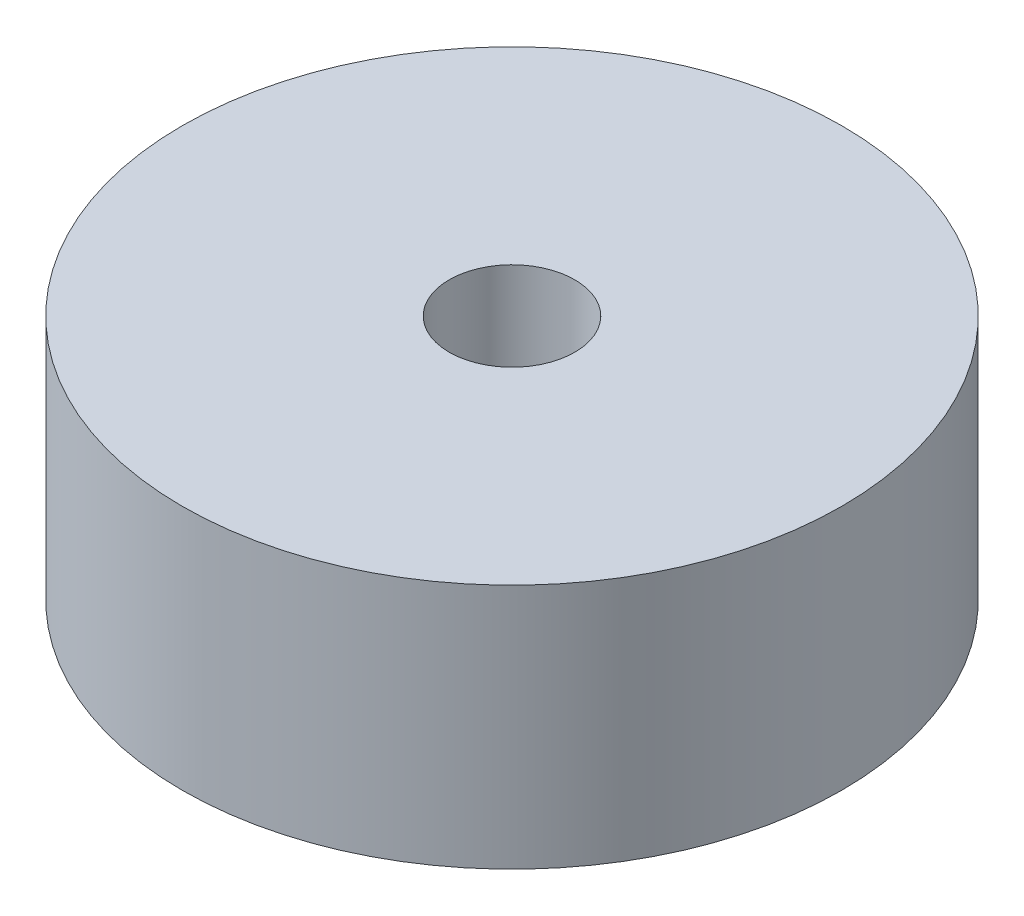
ISO-10303-21;
HEADER;
FILE_DESCRIPTION(('STEP AP214'),'2;1');
FILE_NAME('part.step','',(''),(''),'','','');
FILE_SCHEMA(('AUTOMOTIVE_DESIGN { 1 0 10303 214 1 1 1 1 }'));
ENDSEC;
DATA;
#1=APPLICATION_CONTEXT('core data for automotive mechanical design processes');
#2=APPLICATION_PROTOCOL_DEFINITION('international standard','automotive_design',2000,#1);
#3=PRODUCT_CONTEXT('',#1,'mechanical');
#4=PRODUCT('Part','Part','',(#3));
#5=PRODUCT_RELATED_PRODUCT_CATEGORY('part','',(#4));
#6=PRODUCT_DEFINITION_FORMATION('','',#4);
#7=PRODUCT_DEFINITION_CONTEXT('part definition',#1,'design');
#8=PRODUCT_DEFINITION('design','',#6,#7);
#9=PRODUCT_DEFINITION_SHAPE('','',#8);
#10=(LENGTH_UNIT() NAMED_UNIT(*) SI_UNIT(.MILLI.,.METRE.));
#11=(NAMED_UNIT(*) PLANE_ANGLE_UNIT() SI_UNIT($,.RADIAN.));
#12=(NAMED_UNIT(*) SI_UNIT($,.STERADIAN.) SOLID_ANGLE_UNIT());
#13=UNCERTAINTY_MEASURE_WITH_UNIT(LENGTH_MEASURE(1.E-05),#10,'distance_accuracy_value','');
#14=(GEOMETRIC_REPRESENTATION_CONTEXT(3) GLOBAL_UNCERTAINTY_ASSIGNED_CONTEXT((#13)) GLOBAL_UNIT_ASSIGNED_CONTEXT((#10,
#11,#12)) REPRESENTATION_CONTEXT('',''));
#15=CARTESIAN_POINT('',(0.,0.,0.));
#16=DIRECTION('',(0.,0.,1.));
#17=DIRECTION('',(1.,0.,0.));
#18=AXIS2_PLACEMENT_3D('',#15,#16,#17);
#19=CARTESIAN_POINT('',(0.,23.5,0.));
#20=DIRECTION('',(0.,-1.,0.));
#21=DIRECTION('',(0.,0.,-1.));
#22=AXIS2_PLACEMENT_3D('',#19,#20,#21);
#23=CYLINDRICAL_SURFACE('',#22,31.5);
#24=CARTESIAN_POINT('',(0.,23.5,0.));
#25=DIRECTION('',(0.,1.,0.));
#26=DIRECTION('',(0.,0.,1.));
#27=AXIS2_PLACEMENT_3D('',#24,#25,#26);
#28=CIRCLE('',#27,31.5);
#29=CARTESIAN_POINT('',(0.,23.5,31.5));
#30=VERTEX_POINT('',#29);
#31=EDGE_CURVE('E10',#30,#30,#28,.T.);
#32=ORIENTED_EDGE('',*,*,#31,.F.);
#33=EDGE_LOOP('',(#32));
#34=FACE_BOUND('',#33,.T.);
#35=CARTESIAN_POINT('',(0.,0.,0.));
#36=DIRECTION('',(0.,1.,0.));
#37=DIRECTION('',(0.,0.,1.));
#38=AXIS2_PLACEMENT_3D('',#35,#36,#37);
#39=CIRCLE('',#38,31.5);
#40=CARTESIAN_POINT('',(0.,0.,31.5));
#41=VERTEX_POINT('',#40);
#42=EDGE_CURVE('E33',#41,#41,#39,.T.);
#43=ORIENTED_EDGE('',*,*,#42,.T.);
#44=EDGE_LOOP('',(#43));
#45=FACE_BOUND('',#44,.T.);
#46=ADVANCED_FACE('F30',(#34,#45),#23,.T.);
#47=CARTESIAN_POINT('',(0.,23.5,0.));
#48=DIRECTION('',(0.,1.,0.));
#49=DIRECTION('',(0.,0.,1.));
#50=AXIS2_PLACEMENT_3D('',#47,#48,#49);
#51=PLANE('',#50);
#52=CARTESIAN_POINT('',(0.,23.5,0.));
#53=DIRECTION('',(0.,1.,0.));
#54=DIRECTION('',(0.,0.,1.));
#55=AXIS2_PLACEMENT_3D('',#52,#53,#54);
#56=CIRCLE('',#55,6.);
#57=CARTESIAN_POINT('',(0.,23.5,6.));
#58=VERTEX_POINT('',#57);
#59=EDGE_CURVE('E42',#58,#58,#56,.T.);
#60=ORIENTED_EDGE('',*,*,#59,.F.);
#61=EDGE_LOOP('',(#60));
#62=FACE_BOUND('',#61,.T.);
#63=ORIENTED_EDGE('',*,*,#31,.T.);
#64=EDGE_LOOP('',(#63));
#65=FACE_BOUND('',#64,.T.);
#66=ADVANCED_FACE('F57',(#62,#65),#51,.T.);
#67=CARTESIAN_POINT('',(0.,0.,0.));
#68=DIRECTION('',(0.,1.,0.));
#69=DIRECTION('',(0.,0.,1.));
#70=AXIS2_PLACEMENT_3D('',#67,#68,#69);
#71=PLANE('',#70);
#72=CARTESIAN_POINT('',(0.,0.,0.));
#73=DIRECTION('',(0.,1.,0.));
#74=DIRECTION('',(0.,0.,1.));
#75=AXIS2_PLACEMENT_3D('',#72,#73,#74);
#76=CIRCLE('',#75,6.);
#77=CARTESIAN_POINT('',(0.,0.,6.));
#78=VERTEX_POINT('',#77);
#79=EDGE_CURVE('E40',#78,#78,#76,.T.);
#80=ORIENTED_EDGE('',*,*,#79,.T.);
#81=EDGE_LOOP('',(#80));
#82=FACE_BOUND('',#81,.T.);
#83=ORIENTED_EDGE('',*,*,#42,.F.);
#84=EDGE_LOOP('',(#83));
#85=FACE_BOUND('',#84,.T.);
#86=ADVANCED_FACE('F48',(#82,#85),#71,.F.);
#87=CARTESIAN_POINT('',(0.,0.,0.));
#88=DIRECTION('',(0.,1.,0.));
#89=DIRECTION('',(0.,0.,1.));
#90=AXIS2_PLACEMENT_3D('',#87,#88,#89);
#91=CYLINDRICAL_SURFACE('',#90,6.);
#92=ORIENTED_EDGE('',*,*,#79,.F.);
#93=EDGE_LOOP('',(#92));
#94=FACE_BOUND('',#93,.T.);
#95=ORIENTED_EDGE('',*,*,#59,.T.);
#96=EDGE_LOOP('',(#95));
#97=FACE_BOUND('',#96,.T.);
#98=ADVANCED_FACE('F51',(#94,#97),#91,.F.);
#99=CLOSED_SHELL('',(#46,#66,#86,#98));
#100=MANIFOLD_SOLID_BREP('B2',#99);
#101=ADVANCED_BREP_SHAPE_REPRESENTATION('',(#18,#100),#14);
#102=SHAPE_DEFINITION_REPRESENTATION(#9,#101);
ENDSEC;
END-ISO-10303-21;
